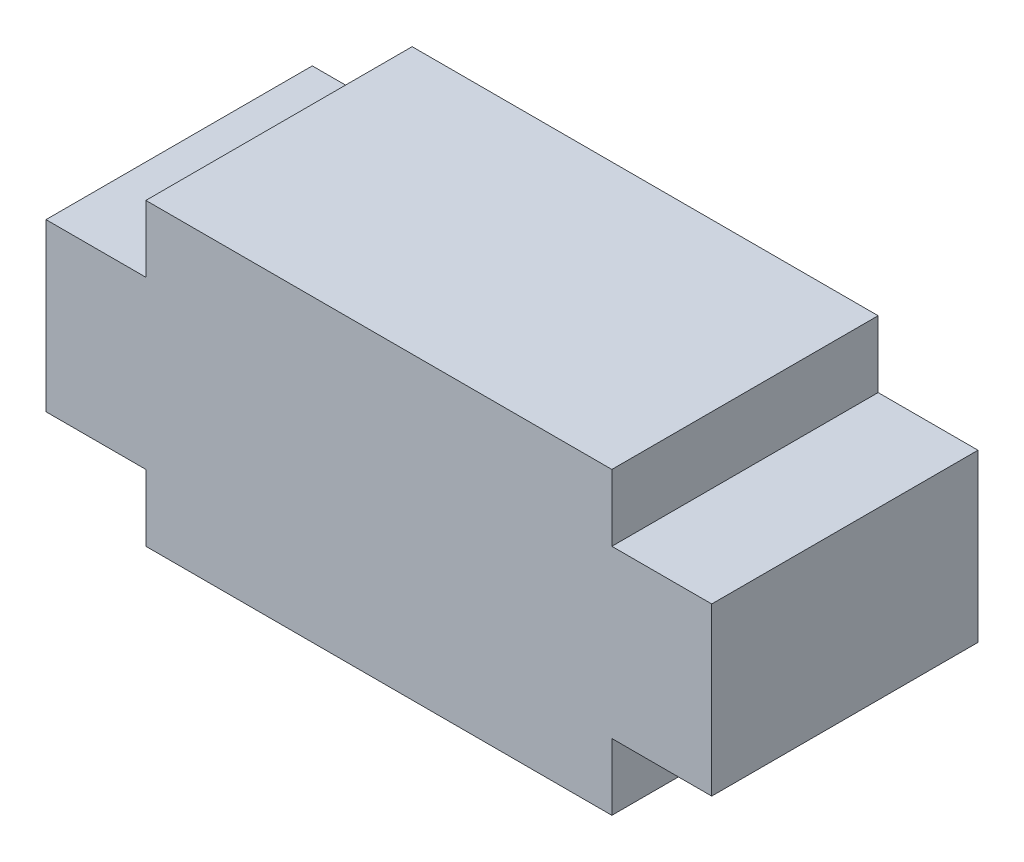
ISO-10303-21;
HEADER;
FILE_DESCRIPTION(('STEP AP214'),'2;1');
FILE_NAME('part.step','',(''),(''),'','','');
FILE_SCHEMA(('AUTOMOTIVE_DESIGN { 1 0 10303 214 1 1 1 1 }'));
ENDSEC;
DATA;
#1=APPLICATION_CONTEXT('core data for automotive mechanical design processes');
#2=APPLICATION_PROTOCOL_DEFINITION('international standard','automotive_design',2000,#1);
#3=PRODUCT_CONTEXT('',#1,'mechanical');
#4=PRODUCT('Part','Part','',(#3));
#5=PRODUCT_RELATED_PRODUCT_CATEGORY('part','',(#4));
#6=PRODUCT_DEFINITION_FORMATION('','',#4);
#7=PRODUCT_DEFINITION_CONTEXT('part definition',#1,'design');
#8=PRODUCT_DEFINITION('design','',#6,#7);
#9=PRODUCT_DEFINITION_SHAPE('','',#8);
#10=(LENGTH_UNIT() NAMED_UNIT(*) SI_UNIT(.MILLI.,.METRE.));
#11=(NAMED_UNIT(*) PLANE_ANGLE_UNIT() SI_UNIT($,.RADIAN.));
#12=(NAMED_UNIT(*) SI_UNIT($,.STERADIAN.) SOLID_ANGLE_UNIT());
#13=UNCERTAINTY_MEASURE_WITH_UNIT(LENGTH_MEASURE(1.E-05),#10,'distance_accuracy_value','');
#14=(GEOMETRIC_REPRESENTATION_CONTEXT(3) GLOBAL_UNCERTAINTY_ASSIGNED_CONTEXT((#13)) GLOBAL_UNIT_ASSIGNED_CONTEXT((#10,
#11,#12)) REPRESENTATION_CONTEXT('',''));
#15=CARTESIAN_POINT('',(0.,0.,0.));
#16=DIRECTION('',(0.,0.,1.));
#17=DIRECTION('',(1.,0.,0.));
#18=AXIS2_PLACEMENT_3D('',#15,#16,#17);
#19=CARTESIAN_POINT('',(1.,0.25,0.8));
#20=DIRECTION('',(-1.,0.,0.));
#21=DIRECTION('',(0.,0.,1.));
#22=AXIS2_PLACEMENT_3D('',#19,#20,#21);
#23=PLANE('',#22);
#24=DIRECTION('',(0.,1.,0.));
#25=VECTOR('',#24,1.);
#26=CARTESIAN_POINT('',(1.,0.25,0.));
#27=LINE('',#26,#25);
#28=CARTESIAN_POINT('',(1.,-0.25,0.));
#29=VERTEX_POINT('',#28);
#30=CARTESIAN_POINT('',(1.,0.25,0.));
#31=VERTEX_POINT('',#30);
#32=EDGE_CURVE('E154',#29,#31,#27,.T.);
#33=ORIENTED_EDGE('',*,*,#32,.T.);
#34=DIRECTION('',(0.,0.,-1.));
#35=VECTOR('',#34,1.);
#36=CARTESIAN_POINT('',(1.,0.25,0.8));
#37=LINE('',#36,#35);
#38=CARTESIAN_POINT('',(1.,0.25,0.8));
#39=VERTEX_POINT('',#38);
#40=EDGE_CURVE('E11',#39,#31,#37,.T.);
#41=ORIENTED_EDGE('',*,*,#40,.F.);
#42=DIRECTION('',(0.,1.,0.));
#43=VECTOR('',#42,1.);
#44=CARTESIAN_POINT('',(1.,0.25,0.8));
#45=LINE('',#44,#43);
#46=CARTESIAN_POINT('',(1.,-0.25,0.8));
#47=VERTEX_POINT('',#46);
#48=EDGE_CURVE('E176',#47,#39,#45,.T.);
#49=ORIENTED_EDGE('',*,*,#48,.F.);
#50=DIRECTION('',(0.,0.,-1.));
#51=VECTOR('',#50,1.);
#52=CARTESIAN_POINT('',(1.,-0.25,0.8));
#53=LINE('',#52,#51);
#54=EDGE_CURVE('E150',#47,#29,#53,.T.);
#55=ORIENTED_EDGE('',*,*,#54,.T.);
#56=EDGE_LOOP('',(#33,#41,#49,#55));
#57=FACE_BOUND('',#56,.T.);
#58=ADVANCED_FACE('F34',(#57),#23,.F.);
#59=CARTESIAN_POINT('',(0.7,0.25,0.8));
#60=DIRECTION('',(0.,-1.,0.));
#61=DIRECTION('',(0.,0.,-1.));
#62=AXIS2_PLACEMENT_3D('',#59,#60,#61);
#63=PLANE('',#62);
#64=DIRECTION('',(-1.,0.,0.));
#65=VECTOR('',#64,1.);
#66=CARTESIAN_POINT('',(0.7,0.25,0.));
#67=LINE('',#66,#65);
#68=CARTESIAN_POINT('',(0.7,0.25,0.));
#69=VERTEX_POINT('',#68);
#70=EDGE_CURVE('E157',#31,#69,#67,.T.);
#71=ORIENTED_EDGE('',*,*,#70,.T.);
#72=DIRECTION('',(0.,0.,-1.));
#73=VECTOR('',#72,1.);
#74=CARTESIAN_POINT('',(0.7,0.25,0.8));
#75=LINE('',#74,#73);
#76=CARTESIAN_POINT('',(0.7,0.25,0.8));
#77=VERTEX_POINT('',#76);
#78=EDGE_CURVE('E42',#77,#69,#75,.T.);
#79=ORIENTED_EDGE('',*,*,#78,.F.);
#80=DIRECTION('',(-1.,0.,0.));
#81=VECTOR('',#80,1.);
#82=CARTESIAN_POINT('',(0.7,0.25,0.8));
#83=LINE('',#82,#81);
#84=EDGE_CURVE('E105',#39,#77,#83,.T.);
#85=ORIENTED_EDGE('',*,*,#84,.F.);
#86=ORIENTED_EDGE('',*,*,#40,.T.);
#87=EDGE_LOOP('',(#71,#79,#85,#86));
#88=FACE_BOUND('',#87,.T.);
#89=ADVANCED_FACE('F254',(#88),#63,.F.);
#90=CARTESIAN_POINT('',(0.7,0.45,0.8));
#91=DIRECTION('',(-1.,0.,0.));
#92=DIRECTION('',(0.,0.,1.));
#93=AXIS2_PLACEMENT_3D('',#90,#91,#92);
#94=PLANE('',#93);
#95=DIRECTION('',(0.,1.,0.));
#96=VECTOR('',#95,1.);
#97=CARTESIAN_POINT('',(0.7,0.45,0.));
#98=LINE('',#97,#96);
#99=CARTESIAN_POINT('',(0.7,0.45,0.));
#100=VERTEX_POINT('',#99);
#101=EDGE_CURVE('E159',#69,#100,#98,.T.);
#102=ORIENTED_EDGE('',*,*,#101,.T.);
#103=DIRECTION('',(0.,0.,-1.));
#104=VECTOR('',#103,1.);
#105=CARTESIAN_POINT('',(0.7,0.45,0.8));
#106=LINE('',#105,#104);
#107=CARTESIAN_POINT('',(0.7,0.45,0.8));
#108=VERTEX_POINT('',#107);
#109=EDGE_CURVE('E195',#108,#100,#106,.T.);
#110=ORIENTED_EDGE('',*,*,#109,.F.);
#111=DIRECTION('',(0.,1.,0.));
#112=VECTOR('',#111,1.);
#113=CARTESIAN_POINT('',(0.7,0.45,0.8));
#114=LINE('',#113,#112);
#115=EDGE_CURVE('E203',#77,#108,#114,.T.);
#116=ORIENTED_EDGE('',*,*,#115,.F.);
#117=ORIENTED_EDGE('',*,*,#78,.T.);
#118=EDGE_LOOP('',(#102,#110,#116,#117));
#119=FACE_BOUND('',#118,.T.);
#120=ADVANCED_FACE('F201',(#119),#94,.F.);
#121=CARTESIAN_POINT('',(-0.7,0.45,0.8));
#122=DIRECTION('',(0.,-1.,0.));
#123=DIRECTION('',(0.,0.,-1.));
#124=AXIS2_PLACEMENT_3D('',#121,#122,#123);
#125=PLANE('',#124);
#126=DIRECTION('',(-1.,0.,0.));
#127=VECTOR('',#126,1.);
#128=CARTESIAN_POINT('',(-0.7,0.45,0.));
#129=LINE('',#128,#127);
#130=CARTESIAN_POINT('',(-0.7,0.45,0.));
#131=VERTEX_POINT('',#130);
#132=EDGE_CURVE('E161',#100,#131,#129,.T.);
#133=ORIENTED_EDGE('',*,*,#132,.T.);
#134=DIRECTION('',(0.,0.,-1.));
#135=VECTOR('',#134,1.);
#136=CARTESIAN_POINT('',(-0.7,0.45,0.8));
#137=LINE('',#136,#135);
#138=CARTESIAN_POINT('',(-0.7,0.45,0.8));
#139=VERTEX_POINT('',#138);
#140=EDGE_CURVE('E192',#139,#131,#137,.T.);
#141=ORIENTED_EDGE('',*,*,#140,.F.);
#142=DIRECTION('',(-1.,0.,0.));
#143=VECTOR('',#142,1.);
#144=CARTESIAN_POINT('',(-0.7,0.45,0.8));
#145=LINE('',#144,#143);
#146=EDGE_CURVE('E221',#108,#139,#145,.T.);
#147=ORIENTED_EDGE('',*,*,#146,.F.);
#148=ORIENTED_EDGE('',*,*,#109,.T.);
#149=EDGE_LOOP('',(#133,#141,#147,#148));
#150=FACE_BOUND('',#149,.T.);
#151=ADVANCED_FACE('F212',(#150),#125,.F.);
#152=CARTESIAN_POINT('',(-0.7,0.25,0.8));
#153=DIRECTION('',(1.,0.,0.));
#154=DIRECTION('',(0.,0.,-1.));
#155=AXIS2_PLACEMENT_3D('',#152,#153,#154);
#156=PLANE('',#155);
#157=DIRECTION('',(0.,-1.,0.));
#158=VECTOR('',#157,1.);
#159=CARTESIAN_POINT('',(-0.7,0.25,0.));
#160=LINE('',#159,#158);
#161=CARTESIAN_POINT('',(-0.7,0.25,0.));
#162=VERTEX_POINT('',#161);
#163=EDGE_CURVE('E163',#131,#162,#160,.T.);
#164=ORIENTED_EDGE('',*,*,#163,.T.);
#165=DIRECTION('',(0.,0.,-1.));
#166=VECTOR('',#165,1.);
#167=CARTESIAN_POINT('',(-0.7,0.25,0.8));
#168=LINE('',#167,#166);
#169=CARTESIAN_POINT('',(-0.7,0.25,0.8));
#170=VERTEX_POINT('',#169);
#171=EDGE_CURVE('E189',#170,#162,#168,.T.);
#172=ORIENTED_EDGE('',*,*,#171,.F.);
#173=DIRECTION('',(0.,-1.,0.));
#174=VECTOR('',#173,1.);
#175=CARTESIAN_POINT('',(-0.7,0.25,0.8));
#176=LINE('',#175,#174);
#177=EDGE_CURVE('E218',#139,#170,#176,.T.);
#178=ORIENTED_EDGE('',*,*,#177,.F.);
#179=ORIENTED_EDGE('',*,*,#140,.T.);
#180=EDGE_LOOP('',(#164,#172,#178,#179));
#181=FACE_BOUND('',#180,.T.);
#182=ADVANCED_FACE('F216',(#181),#156,.F.);
#183=CARTESIAN_POINT('',(-1.,0.25,0.8));
#184=DIRECTION('',(0.,-1.,0.));
#185=DIRECTION('',(0.,0.,-1.));
#186=AXIS2_PLACEMENT_3D('',#183,#184,#185);
#187=PLANE('',#186);
#188=DIRECTION('',(-1.,0.,0.));
#189=VECTOR('',#188,1.);
#190=CARTESIAN_POINT('',(-1.,0.25,0.));
#191=LINE('',#190,#189);
#192=CARTESIAN_POINT('',(-1.,0.25,0.));
#193=VERTEX_POINT('',#192);
#194=EDGE_CURVE('E165',#162,#193,#191,.T.);
#195=ORIENTED_EDGE('',*,*,#194,.T.);
#196=DIRECTION('',(0.,0.,-1.));
#197=VECTOR('',#196,1.);
#198=CARTESIAN_POINT('',(-1.,0.25,0.8));
#199=LINE('',#198,#197);
#200=CARTESIAN_POINT('',(-1.,0.25,0.8));
#201=VERTEX_POINT('',#200);
#202=EDGE_CURVE('E186',#201,#193,#199,.T.);
#203=ORIENTED_EDGE('',*,*,#202,.F.);
#204=DIRECTION('',(-1.,0.,0.));
#205=VECTOR('',#204,1.);
#206=CARTESIAN_POINT('',(-1.,0.25,0.8));
#207=LINE('',#206,#205);
#208=EDGE_CURVE('E220',#170,#201,#207,.T.);
#209=ORIENTED_EDGE('',*,*,#208,.F.);
#210=ORIENTED_EDGE('',*,*,#171,.T.);
#211=EDGE_LOOP('',(#195,#203,#209,#210));
#212=FACE_BOUND('',#211,.T.);
#213=ADVANCED_FACE('F267',(#212),#187,.F.);
#214=CARTESIAN_POINT('',(-1.,-0.25,0.8));
#215=DIRECTION('',(1.,0.,0.));
#216=DIRECTION('',(0.,0.,-1.));
#217=AXIS2_PLACEMENT_3D('',#214,#215,#216);
#218=PLANE('',#217);
#219=DIRECTION('',(0.,-1.,0.));
#220=VECTOR('',#219,1.);
#221=CARTESIAN_POINT('',(-1.,-0.25,0.));
#222=LINE('',#221,#220);
#223=CARTESIAN_POINT('',(-1.,-0.25,0.));
#224=VERTEX_POINT('',#223);
#225=EDGE_CURVE('E167',#193,#224,#222,.T.);
#226=ORIENTED_EDGE('',*,*,#225,.T.);
#227=DIRECTION('',(0.,0.,-1.));
#228=VECTOR('',#227,1.);
#229=CARTESIAN_POINT('',(-1.,-0.25,0.8));
#230=LINE('',#229,#228);
#231=CARTESIAN_POINT('',(-1.,-0.25,0.8));
#232=VERTEX_POINT('',#231);
#233=EDGE_CURVE('E183',#232,#224,#230,.T.);
#234=ORIENTED_EDGE('',*,*,#233,.F.);
#235=DIRECTION('',(0.,-1.,0.));
#236=VECTOR('',#235,1.);
#237=CARTESIAN_POINT('',(-1.,-0.25,0.8));
#238=LINE('',#237,#236);
#239=EDGE_CURVE('E223',#201,#232,#238,.T.);
#240=ORIENTED_EDGE('',*,*,#239,.F.);
#241=ORIENTED_EDGE('',*,*,#202,.T.);
#242=EDGE_LOOP('',(#226,#234,#240,#241));
#243=FACE_BOUND('',#242,.T.);
#244=ADVANCED_FACE('F270',(#243),#218,.F.);
#245=CARTESIAN_POINT('',(-0.7,-0.25,0.8));
#246=DIRECTION('',(0.,1.,0.));
#247=DIRECTION('',(0.,0.,1.));
#248=AXIS2_PLACEMENT_3D('',#245,#246,#247);
#249=PLANE('',#248);
#250=DIRECTION('',(1.,0.,0.));
#251=VECTOR('',#250,1.);
#252=CARTESIAN_POINT('',(-0.7,-0.25,0.));
#253=LINE('',#252,#251);
#254=CARTESIAN_POINT('',(-0.7,-0.25,0.));
#255=VERTEX_POINT('',#254);
#256=EDGE_CURVE('E169',#224,#255,#253,.T.);
#257=ORIENTED_EDGE('',*,*,#256,.T.);
#258=DIRECTION('',(0.,0.,-1.));
#259=VECTOR('',#258,1.);
#260=CARTESIAN_POINT('',(-0.7,-0.25,0.8));
#261=LINE('',#260,#259);
#262=CARTESIAN_POINT('',(-0.7,-0.25,0.8));
#263=VERTEX_POINT('',#262);
#264=EDGE_CURVE('E180',#263,#255,#261,.T.);
#265=ORIENTED_EDGE('',*,*,#264,.F.);
#266=DIRECTION('',(1.,0.,0.));
#267=VECTOR('',#266,1.);
#268=CARTESIAN_POINT('',(-0.7,-0.25,0.8));
#269=LINE('',#268,#267);
#270=EDGE_CURVE('E229',#232,#263,#269,.T.);
#271=ORIENTED_EDGE('',*,*,#270,.F.);
#272=ORIENTED_EDGE('',*,*,#233,.T.);
#273=EDGE_LOOP('',(#257,#265,#271,#272));
#274=FACE_BOUND('',#273,.T.);
#275=ADVANCED_FACE('F235',(#274),#249,.F.);
#276=CARTESIAN_POINT('',(-0.7,-0.45,0.8));
#277=DIRECTION('',(1.,0.,0.));
#278=DIRECTION('',(0.,0.,-1.));
#279=AXIS2_PLACEMENT_3D('',#276,#277,#278);
#280=PLANE('',#279);
#281=DIRECTION('',(0.,-1.,0.));
#282=VECTOR('',#281,1.);
#283=CARTESIAN_POINT('',(-0.7,-0.45,0.));
#284=LINE('',#283,#282);
#285=CARTESIAN_POINT('',(-0.7,-0.45,0.));
#286=VERTEX_POINT('',#285);
#287=EDGE_CURVE('E171',#255,#286,#284,.T.);
#288=ORIENTED_EDGE('',*,*,#287,.T.);
#289=DIRECTION('',(0.,0.,-1.));
#290=VECTOR('',#289,1.);
#291=CARTESIAN_POINT('',(-0.7,-0.45,0.8));
#292=LINE('',#291,#290);
#293=CARTESIAN_POINT('',(-0.7,-0.45,0.8));
#294=VERTEX_POINT('',#293);
#295=EDGE_CURVE('E145',#294,#286,#292,.T.);
#296=ORIENTED_EDGE('',*,*,#295,.F.);
#297=DIRECTION('',(0.,-1.,0.));
#298=VECTOR('',#297,1.);
#299=CARTESIAN_POINT('',(-0.7,-0.45,0.8));
#300=LINE('',#299,#298);
#301=EDGE_CURVE('E136',#263,#294,#300,.T.);
#302=ORIENTED_EDGE('',*,*,#301,.F.);
#303=ORIENTED_EDGE('',*,*,#264,.T.);
#304=EDGE_LOOP('',(#288,#296,#302,#303));
#305=FACE_BOUND('',#304,.T.);
#306=ADVANCED_FACE('F239',(#305),#280,.F.);
#307=CARTESIAN_POINT('',(0.7,-0.45,0.8));
#308=DIRECTION('',(0.,1.,0.));
#309=DIRECTION('',(0.,0.,1.));
#310=AXIS2_PLACEMENT_3D('',#307,#308,#309);
#311=PLANE('',#310);
#312=DIRECTION('',(1.,0.,0.));
#313=VECTOR('',#312,1.);
#314=CARTESIAN_POINT('',(0.7,-0.45,0.));
#315=LINE('',#314,#313);
#316=CARTESIAN_POINT('',(0.7,-0.45,0.));
#317=VERTEX_POINT('',#316);
#318=EDGE_CURVE('E144',#286,#317,#315,.T.);
#319=ORIENTED_EDGE('',*,*,#318,.T.);
#320=DIRECTION('',(0.,0.,-1.));
#321=VECTOR('',#320,1.);
#322=CARTESIAN_POINT('',(0.7,-0.45,0.8));
#323=LINE('',#322,#321);
#324=CARTESIAN_POINT('',(0.7,-0.45,0.8));
#325=VERTEX_POINT('',#324);
#326=EDGE_CURVE('E141',#325,#317,#323,.T.);
#327=ORIENTED_EDGE('',*,*,#326,.F.);
#328=DIRECTION('',(1.,0.,0.));
#329=VECTOR('',#328,1.);
#330=CARTESIAN_POINT('',(0.7,-0.45,0.8));
#331=LINE('',#330,#329);
#332=EDGE_CURVE('E130',#294,#325,#331,.T.);
#333=ORIENTED_EDGE('',*,*,#332,.F.);
#334=ORIENTED_EDGE('',*,*,#295,.T.);
#335=EDGE_LOOP('',(#319,#327,#333,#334));
#336=FACE_BOUND('',#335,.T.);
#337=ADVANCED_FACE('F142',(#336),#311,.F.);
#338=CARTESIAN_POINT('',(0.7,-0.25,0.8));
#339=DIRECTION('',(-1.,0.,0.));
#340=DIRECTION('',(0.,0.,1.));
#341=AXIS2_PLACEMENT_3D('',#338,#339,#340);
#342=PLANE('',#341);
#343=DIRECTION('',(0.,1.,0.));
#344=VECTOR('',#343,1.);
#345=CARTESIAN_POINT('',(0.7,-0.25,0.));
#346=LINE('',#345,#344);
#347=CARTESIAN_POINT('',(0.7,-0.25,0.));
#348=VERTEX_POINT('',#347);
#349=EDGE_CURVE('E91',#317,#348,#346,.T.);
#350=ORIENTED_EDGE('',*,*,#349,.T.);
#351=DIRECTION('',(0.,0.,-1.));
#352=VECTOR('',#351,1.);
#353=CARTESIAN_POINT('',(0.7,-0.25,0.8));
#354=LINE('',#353,#352);
#355=CARTESIAN_POINT('',(0.7,-0.25,0.8));
#356=VERTEX_POINT('',#355);
#357=EDGE_CURVE('E146',#356,#348,#354,.T.);
#358=ORIENTED_EDGE('',*,*,#357,.F.);
#359=DIRECTION('',(0.,1.,0.));
#360=VECTOR('',#359,1.);
#361=CARTESIAN_POINT('',(0.7,-0.25,0.8));
#362=LINE('',#361,#360);
#363=EDGE_CURVE('E134',#325,#356,#362,.T.);
#364=ORIENTED_EDGE('',*,*,#363,.F.);
#365=ORIENTED_EDGE('',*,*,#326,.T.);
#366=EDGE_LOOP('',(#350,#358,#364,#365));
#367=FACE_BOUND('',#366,.T.);
#368=ADVANCED_FACE('F148',(#367),#342,.F.);
#369=CARTESIAN_POINT('',(1.,-0.25,0.8));
#370=DIRECTION('',(0.,1.,0.));
#371=DIRECTION('',(0.,0.,1.));
#372=AXIS2_PLACEMENT_3D('',#369,#370,#371);
#373=PLANE('',#372);
#374=DIRECTION('',(1.,0.,0.));
#375=VECTOR('',#374,1.);
#376=CARTESIAN_POINT('',(1.,-0.25,0.));
#377=LINE('',#376,#375);
#378=EDGE_CURVE('E97',#348,#29,#377,.T.);
#379=ORIENTED_EDGE('',*,*,#378,.T.);
#380=ORIENTED_EDGE('',*,*,#54,.F.);
#381=DIRECTION('',(1.,0.,0.));
#382=VECTOR('',#381,1.);
#383=CARTESIAN_POINT('',(1.,-0.25,0.8));
#384=LINE('',#383,#382);
#385=EDGE_CURVE('E50',#356,#47,#384,.T.);
#386=ORIENTED_EDGE('',*,*,#385,.F.);
#387=ORIENTED_EDGE('',*,*,#357,.T.);
#388=EDGE_LOOP('',(#379,#380,#386,#387));
#389=FACE_BOUND('',#388,.T.);
#390=ADVANCED_FACE('F243',(#389),#373,.F.);
#391=CARTESIAN_POINT('',(0.,0.,0.8));
#392=DIRECTION('',(0.,0.,-1.));
#393=DIRECTION('',(-1.,0.,0.));
#394=AXIS2_PLACEMENT_3D('',#391,#392,#393);
#395=PLANE('',#394);
#396=ORIENTED_EDGE('',*,*,#48,.T.);
#397=ORIENTED_EDGE('',*,*,#84,.T.);
#398=ORIENTED_EDGE('',*,*,#115,.T.);
#399=ORIENTED_EDGE('',*,*,#146,.T.);
#400=ORIENTED_EDGE('',*,*,#177,.T.);
#401=ORIENTED_EDGE('',*,*,#208,.T.);
#402=ORIENTED_EDGE('',*,*,#239,.T.);
#403=ORIENTED_EDGE('',*,*,#270,.T.);
#404=ORIENTED_EDGE('',*,*,#301,.T.);
#405=ORIENTED_EDGE('',*,*,#332,.T.);
#406=ORIENTED_EDGE('',*,*,#363,.T.);
#407=ORIENTED_EDGE('',*,*,#385,.T.);
#408=EDGE_LOOP('',(#396,#397,#398,#399,#400,#401,#402,#403,#404,#405,#406,#407));
#409=FACE_BOUND('',#408,.T.);
#410=ADVANCED_FACE('F132',(#409),#395,.F.);
#411=CARTESIAN_POINT('',(0.,0.,0.));
#412=DIRECTION('',(0.,0.,-1.));
#413=DIRECTION('',(-1.,0.,0.));
#414=AXIS2_PLACEMENT_3D('',#411,#412,#413);
#415=PLANE('',#414);
#416=ORIENTED_EDGE('',*,*,#32,.F.);
#417=ORIENTED_EDGE('',*,*,#378,.F.);
#418=ORIENTED_EDGE('',*,*,#349,.F.);
#419=ORIENTED_EDGE('',*,*,#318,.F.);
#420=ORIENTED_EDGE('',*,*,#287,.F.);
#421=ORIENTED_EDGE('',*,*,#256,.F.);
#422=ORIENTED_EDGE('',*,*,#225,.F.);
#423=ORIENTED_EDGE('',*,*,#194,.F.);
#424=ORIENTED_EDGE('',*,*,#163,.F.);
#425=ORIENTED_EDGE('',*,*,#132,.F.);
#426=ORIENTED_EDGE('',*,*,#101,.F.);
#427=ORIENTED_EDGE('',*,*,#70,.F.);
#428=EDGE_LOOP('',(#416,#417,#418,#419,#420,#421,#422,#423,#424,#425,#426,#427));
#429=FACE_BOUND('',#428,.T.);
#430=ADVANCED_FACE('F207',(#429),#415,.T.);
#431=CLOSED_SHELL('',(#58,#89,#120,#151,#182,#213,#244,#275,#306,#337,#368,#390,#410,#430));
#432=MANIFOLD_SOLID_BREP('B2',#431);
#433=ADVANCED_BREP_SHAPE_REPRESENTATION('',(#18,#432),#14);
#434=SHAPE_DEFINITION_REPRESENTATION(#9,#433);
ENDSEC;
END-ISO-10303-21;
